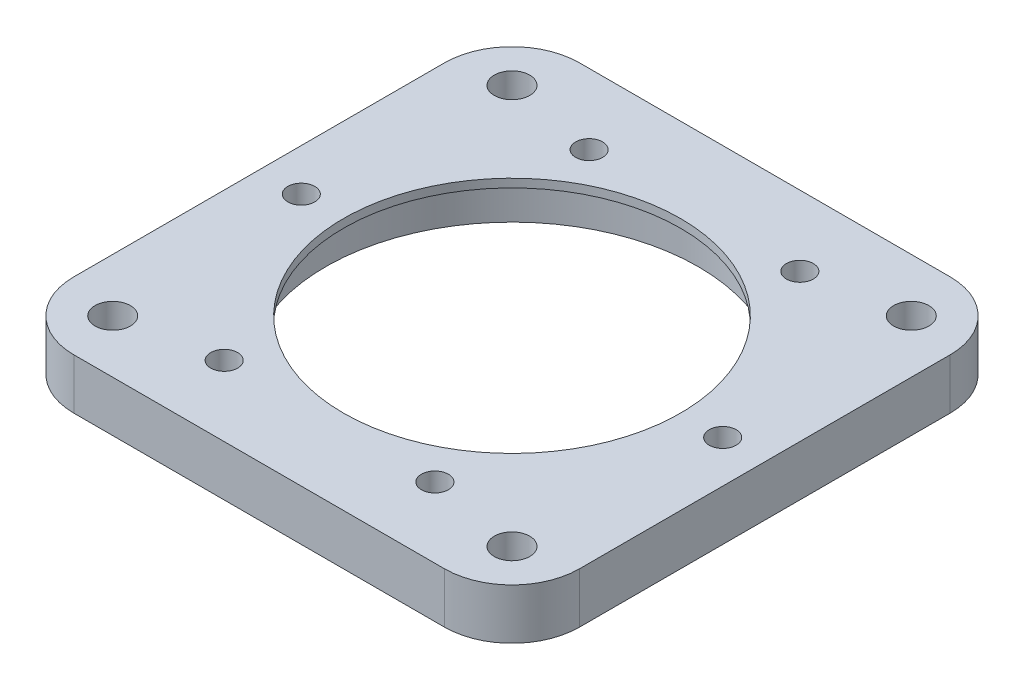
ISO-10303-21;
HEADER;
FILE_DESCRIPTION(('STEP AP214'),'2;1');
FILE_NAME('part.step','',(''),(''),'','','');
FILE_SCHEMA(('AUTOMOTIVE_DESIGN { 1 0 10303 214 1 1 1 1 }'));
ENDSEC;
DATA;
#1=APPLICATION_CONTEXT('core data for automotive mechanical design processes');
#2=APPLICATION_PROTOCOL_DEFINITION('international standard','automotive_design',2000,#1);
#3=PRODUCT_CONTEXT('',#1,'mechanical');
#4=PRODUCT('Part','Part','',(#3));
#5=PRODUCT_RELATED_PRODUCT_CATEGORY('part','',(#4));
#6=PRODUCT_DEFINITION_FORMATION('','',#4);
#7=PRODUCT_DEFINITION_CONTEXT('part definition',#1,'design');
#8=PRODUCT_DEFINITION('design','',#6,#7);
#9=PRODUCT_DEFINITION_SHAPE('','',#8);
#10=(LENGTH_UNIT() NAMED_UNIT(*) SI_UNIT(.MILLI.,.METRE.));
#11=(NAMED_UNIT(*) PLANE_ANGLE_UNIT() SI_UNIT($,.RADIAN.));
#12=(NAMED_UNIT(*) SI_UNIT($,.STERADIAN.) SOLID_ANGLE_UNIT());
#13=UNCERTAINTY_MEASURE_WITH_UNIT(LENGTH_MEASURE(1.E-05),#10,'distance_accuracy_value','');
#14=(GEOMETRIC_REPRESENTATION_CONTEXT(3) GLOBAL_UNCERTAINTY_ASSIGNED_CONTEXT((#13)) GLOBAL_UNIT_ASSIGNED_CONTEXT((#10,
#11,#12)) REPRESENTATION_CONTEXT('',''));
#15=CARTESIAN_POINT('',(0.,0.,0.));
#16=DIRECTION('',(0.,0.,1.));
#17=DIRECTION('',(1.,0.,0.));
#18=AXIS2_PLACEMENT_3D('',#15,#16,#17);
#19=CARTESIAN_POINT('',(0.,6.,0.));
#20=DIRECTION('',(0.,-1.,0.));
#21=DIRECTION('',(0.,0.,-1.));
#22=AXIS2_PLACEMENT_3D('',#19,#20,#21);
#23=CYLINDRICAL_SURFACE('',#22,20.);
#24=CARTESIAN_POINT('',(0.,6.,0.));
#25=DIRECTION('',(0.,1.,0.));
#26=DIRECTION('',(0.,0.,1.));
#27=AXIS2_PLACEMENT_3D('',#24,#25,#26);
#28=CIRCLE('',#27,20.);
#29=CARTESIAN_POINT('',(0.,6.,20.));
#30=VERTEX_POINT('',#29);
#31=EDGE_CURVE('E144',#30,#30,#28,.T.);
#32=ORIENTED_EDGE('',*,*,#31,.T.);
#33=EDGE_LOOP('',(#32));
#34=FACE_BOUND('',#33,.T.);
#35=CARTESIAN_POINT('',(0.,5.,0.));
#36=DIRECTION('',(0.,-1.,0.));
#37=DIRECTION('',(0.,0.,-1.));
#38=AXIS2_PLACEMENT_3D('',#35,#36,#37);
#39=CIRCLE('',#38,20.);
#40=CARTESIAN_POINT('',(0.,5.,-20.));
#41=VERTEX_POINT('',#40);
#42=EDGE_CURVE('E141',#41,#41,#39,.T.);
#43=ORIENTED_EDGE('',*,*,#42,.T.);
#44=EDGE_LOOP('',(#43));
#45=FACE_BOUND('',#44,.T.);
#46=ADVANCED_FACE('F41',(#34,#45),#23,.F.);
#47=CARTESIAN_POINT('',(0.,6.,0.));
#48=DIRECTION('',(0.,-1.,0.));
#49=DIRECTION('',(0.,0.,-1.));
#50=AXIS2_PLACEMENT_3D('',#47,#48,#49);
#51=PLANE('',#50);
#52=CARTESIAN_POINT('',(-23.6880771697493,6.,23.6880771697493));
#53=DIRECTION('',(0.,1.,0.));
#54=DIRECTION('',(0.,0.,1.));
#55=AXIS2_PLACEMENT_3D('',#52,#53,#54);
#56=CIRCLE('',#55,2.1);
#57=CARTESIAN_POINT('',(-23.6880771697493,6.,25.7880771697493));
#58=VERTEX_POINT('',#57);
#59=EDGE_CURVE('E220',#58,#58,#56,.T.);
#60=ORIENTED_EDGE('',*,*,#59,.F.);
#61=EDGE_LOOP('',(#60));
#62=FACE_BOUND('',#61,.T.);
#63=CARTESIAN_POINT('',(23.6880771697493,6.,23.6880771697493));
#64=DIRECTION('',(0.,1.,0.));
#65=DIRECTION('',(0.,0.,1.));
#66=AXIS2_PLACEMENT_3D('',#63,#64,#65);
#67=CIRCLE('',#66,2.1);
#68=CARTESIAN_POINT('',(23.6880771697493,6.,25.7880771697493));
#69=VERTEX_POINT('',#68);
#70=EDGE_CURVE('E227',#69,#69,#67,.T.);
#71=ORIENTED_EDGE('',*,*,#70,.F.);
#72=EDGE_LOOP('',(#71));
#73=FACE_BOUND('',#72,.T.);
#74=CARTESIAN_POINT('',(23.6880771697493,6.,-23.6880771697493));
#75=DIRECTION('',(0.,1.,0.));
#76=DIRECTION('',(0.,0.,1.));
#77=AXIS2_PLACEMENT_3D('',#74,#75,#76);
#78=CIRCLE('',#77,2.1);
#79=CARTESIAN_POINT('',(23.6880771697493,6.,-21.5880771697493));
#80=VERTEX_POINT('',#79);
#81=EDGE_CURVE('E233',#80,#80,#78,.T.);
#82=ORIENTED_EDGE('',*,*,#81,.F.);
#83=EDGE_LOOP('',(#82));
#84=FACE_BOUND('',#83,.T.);
#85=CARTESIAN_POINT('',(12.5000000000003,6.,-21.6506350946108));
#86=DIRECTION('',(0.,1.,0.));
#87=DIRECTION('',(0.,0.,1.));
#88=AXIS2_PLACEMENT_3D('',#85,#86,#87);
#89=CIRCLE('',#88,1.6);
#90=CARTESIAN_POINT('',(12.5000000000003,6.,-20.0506350946108));
#91=VERTEX_POINT('',#90);
#92=EDGE_CURVE('E197',#91,#91,#89,.T.);
#93=ORIENTED_EDGE('',*,*,#92,.F.);
#94=EDGE_LOOP('',(#93));
#95=FACE_BOUND('',#94,.T.);
#96=CARTESIAN_POINT('',(-12.4999999999998,6.,-21.6506350946111));
#97=DIRECTION('',(0.,1.,0.));
#98=DIRECTION('',(0.,0.,1.));
#99=AXIS2_PLACEMENT_3D('',#96,#97,#98);
#100=CIRCLE('',#99,1.6);
#101=CARTESIAN_POINT('',(-12.4999999999998,6.,-20.0506350946111));
#102=VERTEX_POINT('',#101);
#103=EDGE_CURVE('E196',#102,#102,#100,.T.);
#104=ORIENTED_EDGE('',*,*,#103,.F.);
#105=EDGE_LOOP('',(#104));
#106=FACE_BOUND('',#105,.T.);
#107=CARTESIAN_POINT('',(-25.,6.,-1.74574066942157E-13));
#108=DIRECTION('',(0.,1.,0.));
#109=DIRECTION('',(0.,0.,1.));
#110=AXIS2_PLACEMENT_3D('',#107,#108,#109);
#111=CIRCLE('',#110,1.6);
#112=CARTESIAN_POINT('',(-25.,6.,1.59999999999983));
#113=VERTEX_POINT('',#112);
#114=EDGE_CURVE('E203',#113,#113,#111,.T.);
#115=ORIENTED_EDGE('',*,*,#114,.F.);
#116=EDGE_LOOP('',(#115));
#117=FACE_BOUND('',#116,.T.);
#118=CARTESIAN_POINT('',(-12.5000000000001,6.,21.6506350946109));
#119=DIRECTION('',(0.,1.,0.));
#120=DIRECTION('',(0.,0.,1.));
#121=AXIS2_PLACEMENT_3D('',#118,#119,#120);
#122=CIRCLE('',#121,1.6);
#123=CARTESIAN_POINT('',(-12.5000000000001,6.,23.2506350946109));
#124=VERTEX_POINT('',#123);
#125=EDGE_CURVE('E209',#124,#124,#122,.T.);
#126=ORIENTED_EDGE('',*,*,#125,.F.);
#127=EDGE_LOOP('',(#126));
#128=FACE_BOUND('',#127,.T.);
#129=CARTESIAN_POINT('',(12.5,6.,21.650635094611));
#130=DIRECTION('',(0.,1.,0.));
#131=DIRECTION('',(0.,0.,1.));
#132=AXIS2_PLACEMENT_3D('',#129,#130,#131);
#133=CIRCLE('',#132,1.6);
#134=CARTESIAN_POINT('',(12.5,6.,23.250635094611));
#135=VERTEX_POINT('',#134);
#136=EDGE_CURVE('E190',#135,#135,#133,.T.);
#137=ORIENTED_EDGE('',*,*,#136,.F.);
#138=EDGE_LOOP('',(#137));
#139=FACE_BOUND('',#138,.T.);
#140=CARTESIAN_POINT('',(-23.6880771697493,6.,-23.6880771697493));
#141=DIRECTION('',(0.,1.,0.));
#142=DIRECTION('',(0.,0.,1.));
#143=AXIS2_PLACEMENT_3D('',#140,#141,#142);
#144=CIRCLE('',#143,2.1);
#145=CARTESIAN_POINT('',(-23.6880771697493,6.,-21.5880771697493));
#146=VERTEX_POINT('',#145);
#147=EDGE_CURVE('E221',#146,#146,#144,.T.);
#148=ORIENTED_EDGE('',*,*,#147,.F.);
#149=EDGE_LOOP('',(#148));
#150=FACE_BOUND('',#149,.T.);
#151=CARTESIAN_POINT('',(25.,6.,0.));
#152=DIRECTION('',(0.,1.,0.));
#153=DIRECTION('',(0.,0.,1.));
#154=AXIS2_PLACEMENT_3D('',#151,#152,#153);
#155=CIRCLE('',#154,1.6);
#156=CARTESIAN_POINT('',(25.,6.,1.6));
#157=VERTEX_POINT('',#156);
#158=EDGE_CURVE('E187',#157,#157,#155,.T.);
#159=ORIENTED_EDGE('',*,*,#158,.F.);
#160=EDGE_LOOP('',(#159));
#161=FACE_BOUND('',#160,.T.);
#162=DIRECTION('',(0.,0.,1.));
#163=VECTOR('',#162,1.);
#164=CARTESIAN_POINT('',(-30.,6.,30.));
#165=LINE('',#164,#163);
#166=CARTESIAN_POINT('',(-30.,6.,-22.));
#167=VERTEX_POINT('',#166);
#168=CARTESIAN_POINT('',(-30.,6.,22.));
#169=VERTEX_POINT('',#168);
#170=EDGE_CURVE('E175',#167,#169,#165,.T.);
#171=ORIENTED_EDGE('',*,*,#170,.T.);
#172=CARTESIAN_POINT('',(-22.,6.,22.));
#173=DIRECTION('',(0.,-1.,0.));
#174=DIRECTION('',(0.,0.,-1.));
#175=AXIS2_PLACEMENT_3D('',#172,#173,#174);
#176=CIRCLE('',#175,8.);
#177=CARTESIAN_POINT('',(-22.,6.,30.));
#178=VERTEX_POINT('',#177);
#179=EDGE_CURVE('E159',#169,#178,#176,.F.);
#180=ORIENTED_EDGE('',*,*,#179,.T.);
#181=DIRECTION('',(1.,0.,0.));
#182=VECTOR('',#181,1.);
#183=CARTESIAN_POINT('',(-30.,6.,30.));
#184=LINE('',#183,#182);
#185=CARTESIAN_POINT('',(22.,6.,30.));
#186=VERTEX_POINT('',#185);
#187=EDGE_CURVE('E126',#178,#186,#184,.T.);
#188=ORIENTED_EDGE('',*,*,#187,.T.);
#189=CARTESIAN_POINT('',(22.,6.,22.));
#190=DIRECTION('',(0.,-1.,0.));
#191=DIRECTION('',(0.,0.,-1.));
#192=AXIS2_PLACEMENT_3D('',#189,#190,#191);
#193=CIRCLE('',#192,8.);
#194=CARTESIAN_POINT('',(30.,6.,22.));
#195=VERTEX_POINT('',#194);
#196=EDGE_CURVE('E157',#186,#195,#193,.F.);
#197=ORIENTED_EDGE('',*,*,#196,.T.);
#198=DIRECTION('',(0.,0.,-1.));
#199=VECTOR('',#198,1.);
#200=CARTESIAN_POINT('',(30.,6.,30.));
#201=LINE('',#200,#199);
#202=CARTESIAN_POINT('',(30.,6.,-22.));
#203=VERTEX_POINT('',#202);
#204=EDGE_CURVE('E132',#195,#203,#201,.T.);
#205=ORIENTED_EDGE('',*,*,#204,.T.);
#206=CARTESIAN_POINT('',(22.,6.,-22.));
#207=DIRECTION('',(0.,-1.,0.));
#208=DIRECTION('',(0.,0.,-1.));
#209=AXIS2_PLACEMENT_3D('',#206,#207,#208);
#210=CIRCLE('',#209,8.);
#211=CARTESIAN_POINT('',(22.,6.,-30.));
#212=VERTEX_POINT('',#211);
#213=EDGE_CURVE('E61',#203,#212,#210,.F.);
#214=ORIENTED_EDGE('',*,*,#213,.T.);
#215=DIRECTION('',(-1.,0.,0.));
#216=VECTOR('',#215,1.);
#217=CARTESIAN_POINT('',(-30.,6.,-30.));
#218=LINE('',#217,#216);
#219=CARTESIAN_POINT('',(-22.,6.,-30.));
#220=VERTEX_POINT('',#219);
#221=EDGE_CURVE('E135',#212,#220,#218,.T.);
#222=ORIENTED_EDGE('',*,*,#221,.T.);
#223=CARTESIAN_POINT('',(-22.,6.,-22.));
#224=DIRECTION('',(0.,-1.,0.));
#225=DIRECTION('',(0.,0.,-1.));
#226=AXIS2_PLACEMENT_3D('',#223,#224,#225);
#227=CIRCLE('',#226,8.);
#228=EDGE_CURVE('E155',#220,#167,#227,.F.);
#229=ORIENTED_EDGE('',*,*,#228,.T.);
#230=EDGE_LOOP('',(#171,#180,#188,#197,#205,#214,#222,#229));
#231=FACE_BOUND('',#230,.T.);
#232=ORIENTED_EDGE('',*,*,#31,.F.);
#233=EDGE_LOOP('',(#232));
#234=FACE_BOUND('',#233,.T.);
#235=ADVANCED_FACE('F249',(#62,#73,#84,#95,#106,#117,#128,#139,#150,#161,#231,#234),#51,.F.);
#236=CARTESIAN_POINT('',(0.,0.,0.));
#237=DIRECTION('',(0.,-1.,0.));
#238=DIRECTION('',(0.,0.,-1.));
#239=AXIS2_PLACEMENT_3D('',#236,#237,#238);
#240=PLANE('',#239);
#241=CARTESIAN_POINT('',(-23.6880771697493,0.,23.6880771697493));
#242=DIRECTION('',(0.,1.,0.));
#243=DIRECTION('',(0.,0.,1.));
#244=AXIS2_PLACEMENT_3D('',#241,#242,#243);
#245=CIRCLE('',#244,2.1);
#246=CARTESIAN_POINT('',(-23.6880771697493,0.,25.7880771697493));
#247=VERTEX_POINT('',#246);
#248=EDGE_CURVE('E217',#247,#247,#245,.T.);
#249=ORIENTED_EDGE('',*,*,#248,.T.);
#250=EDGE_LOOP('',(#249));
#251=FACE_BOUND('',#250,.T.);
#252=CARTESIAN_POINT('',(23.6880771697493,0.,23.6880771697493));
#253=DIRECTION('',(0.,1.,0.));
#254=DIRECTION('',(0.,0.,1.));
#255=AXIS2_PLACEMENT_3D('',#252,#253,#254);
#256=CIRCLE('',#255,2.1);
#257=CARTESIAN_POINT('',(23.6880771697493,0.,25.7880771697493));
#258=VERTEX_POINT('',#257);
#259=EDGE_CURVE('E224',#258,#258,#256,.T.);
#260=ORIENTED_EDGE('',*,*,#259,.T.);
#261=EDGE_LOOP('',(#260));
#262=FACE_BOUND('',#261,.T.);
#263=CARTESIAN_POINT('',(23.6880771697493,0.,-23.6880771697493));
#264=DIRECTION('',(0.,1.,0.));
#265=DIRECTION('',(0.,0.,1.));
#266=AXIS2_PLACEMENT_3D('',#263,#264,#265);
#267=CIRCLE('',#266,2.1);
#268=CARTESIAN_POINT('',(23.6880771697493,0.,-21.5880771697493));
#269=VERTEX_POINT('',#268);
#270=EDGE_CURVE('E230',#269,#269,#267,.T.);
#271=ORIENTED_EDGE('',*,*,#270,.T.);
#272=EDGE_LOOP('',(#271));
#273=FACE_BOUND('',#272,.T.);
#274=CARTESIAN_POINT('',(12.5000000000003,0.,-21.6506350946108));
#275=DIRECTION('',(0.,1.,0.));
#276=DIRECTION('',(0.,0.,1.));
#277=AXIS2_PLACEMENT_3D('',#274,#275,#276);
#278=CIRCLE('',#277,1.6);
#279=CARTESIAN_POINT('',(12.5000000000003,0.,-20.0506350946108));
#280=VERTEX_POINT('',#279);
#281=EDGE_CURVE('E236',#280,#280,#278,.T.);
#282=ORIENTED_EDGE('',*,*,#281,.T.);
#283=EDGE_LOOP('',(#282));
#284=FACE_BOUND('',#283,.T.);
#285=CARTESIAN_POINT('',(-12.4999999999998,0.,-21.6506350946111));
#286=DIRECTION('',(0.,1.,0.));
#287=DIRECTION('',(0.,0.,1.));
#288=AXIS2_PLACEMENT_3D('',#285,#286,#287);
#289=CIRCLE('',#288,1.6);
#290=CARTESIAN_POINT('',(-12.4999999999998,0.,-20.0506350946111));
#291=VERTEX_POINT('',#290);
#292=EDGE_CURVE('E193',#291,#291,#289,.T.);
#293=ORIENTED_EDGE('',*,*,#292,.T.);
#294=EDGE_LOOP('',(#293));
#295=FACE_BOUND('',#294,.T.);
#296=CARTESIAN_POINT('',(-25.,0.,-1.74574066942157E-13));
#297=DIRECTION('',(0.,1.,0.));
#298=DIRECTION('',(0.,0.,1.));
#299=AXIS2_PLACEMENT_3D('',#296,#297,#298);
#300=CIRCLE('',#299,1.6);
#301=CARTESIAN_POINT('',(-25.,0.,1.59999999999983));
#302=VERTEX_POINT('',#301);
#303=EDGE_CURVE('E200',#302,#302,#300,.T.);
#304=ORIENTED_EDGE('',*,*,#303,.T.);
#305=EDGE_LOOP('',(#304));
#306=FACE_BOUND('',#305,.T.);
#307=CARTESIAN_POINT('',(-12.5000000000001,0.,21.6506350946109));
#308=DIRECTION('',(0.,1.,0.));
#309=DIRECTION('',(0.,0.,1.));
#310=AXIS2_PLACEMENT_3D('',#307,#308,#309);
#311=CIRCLE('',#310,1.6);
#312=CARTESIAN_POINT('',(-12.5000000000001,0.,23.2506350946109));
#313=VERTEX_POINT('',#312);
#314=EDGE_CURVE('E206',#313,#313,#311,.T.);
#315=ORIENTED_EDGE('',*,*,#314,.T.);
#316=EDGE_LOOP('',(#315));
#317=FACE_BOUND('',#316,.T.);
#318=CARTESIAN_POINT('',(12.5,0.,21.650635094611));
#319=DIRECTION('',(0.,1.,0.));
#320=DIRECTION('',(0.,0.,1.));
#321=AXIS2_PLACEMENT_3D('',#318,#319,#320);
#322=CIRCLE('',#321,1.6);
#323=CARTESIAN_POINT('',(12.5,0.,23.250635094611));
#324=VERTEX_POINT('',#323);
#325=EDGE_CURVE('E212',#324,#324,#322,.T.);
#326=ORIENTED_EDGE('',*,*,#325,.T.);
#327=EDGE_LOOP('',(#326));
#328=FACE_BOUND('',#327,.T.);
#329=CARTESIAN_POINT('',(-23.6880771697493,0.,-23.6880771697493));
#330=DIRECTION('',(0.,1.,0.));
#331=DIRECTION('',(0.,0.,1.));
#332=AXIS2_PLACEMENT_3D('',#329,#330,#331);
#333=CIRCLE('',#332,2.1);
#334=CARTESIAN_POINT('',(-23.6880771697493,0.,-21.5880771697493));
#335=VERTEX_POINT('',#334);
#336=EDGE_CURVE('E241',#335,#335,#333,.T.);
#337=ORIENTED_EDGE('',*,*,#336,.T.);
#338=EDGE_LOOP('',(#337));
#339=FACE_BOUND('',#338,.T.);
#340=CARTESIAN_POINT('',(25.,0.,0.));
#341=DIRECTION('',(0.,1.,0.));
#342=DIRECTION('',(0.,0.,1.));
#343=AXIS2_PLACEMENT_3D('',#340,#341,#342);
#344=CIRCLE('',#343,1.6);
#345=CARTESIAN_POINT('',(25.,0.,1.6));
#346=VERTEX_POINT('',#345);
#347=EDGE_CURVE('E184',#346,#346,#344,.T.);
#348=ORIENTED_EDGE('',*,*,#347,.T.);
#349=EDGE_LOOP('',(#348));
#350=FACE_BOUND('',#349,.T.);
#351=CARTESIAN_POINT('',(0.,0.,0.));
#352=DIRECTION('',(0.,-1.,0.));
#353=DIRECTION('',(0.,0.,-1.));
#354=AXIS2_PLACEMENT_3D('',#351,#352,#353);
#355=CIRCLE('',#354,22.1);
#356=CARTESIAN_POINT('',(0.,0.,-22.1));
#357=VERTEX_POINT('',#356);
#358=EDGE_CURVE('E181',#357,#357,#355,.T.);
#359=ORIENTED_EDGE('',*,*,#358,.F.);
#360=EDGE_LOOP('',(#359));
#361=FACE_BOUND('',#360,.T.);
#362=DIRECTION('',(1.,0.,0.));
#363=VECTOR('',#362,1.);
#364=CARTESIAN_POINT('',(-30.,0.,30.));
#365=LINE('',#364,#363);
#366=CARTESIAN_POINT('',(-22.,0.,30.));
#367=VERTEX_POINT('',#366);
#368=CARTESIAN_POINT('',(22.,0.,30.));
#369=VERTEX_POINT('',#368);
#370=EDGE_CURVE('E123',#367,#369,#365,.T.);
#371=ORIENTED_EDGE('',*,*,#370,.F.);
#372=CARTESIAN_POINT('',(-22.,0.,22.));
#373=DIRECTION('',(0.,-1.,0.));
#374=DIRECTION('',(0.,0.,-1.));
#375=AXIS2_PLACEMENT_3D('',#372,#373,#374);
#376=CIRCLE('',#375,8.);
#377=CARTESIAN_POINT('',(-30.,0.,22.));
#378=VERTEX_POINT('',#377);
#379=EDGE_CURVE('E106',#367,#378,#376,.T.);
#380=ORIENTED_EDGE('',*,*,#379,.T.);
#381=DIRECTION('',(0.,0.,1.));
#382=VECTOR('',#381,1.);
#383=CARTESIAN_POINT('',(-30.,0.,30.));
#384=LINE('',#383,#382);
#385=CARTESIAN_POINT('',(-30.,0.,-22.));
#386=VERTEX_POINT('',#385);
#387=EDGE_CURVE('E133',#386,#378,#384,.T.);
#388=ORIENTED_EDGE('',*,*,#387,.F.);
#389=CARTESIAN_POINT('',(-22.,0.,-22.));
#390=DIRECTION('',(0.,-1.,0.));
#391=DIRECTION('',(0.,0.,-1.));
#392=AXIS2_PLACEMENT_3D('',#389,#390,#391);
#393=CIRCLE('',#392,8.);
#394=CARTESIAN_POINT('',(-22.,0.,-30.));
#395=VERTEX_POINT('',#394);
#396=EDGE_CURVE('E148',#386,#395,#393,.T.);
#397=ORIENTED_EDGE('',*,*,#396,.T.);
#398=DIRECTION('',(-1.,0.,0.));
#399=VECTOR('',#398,1.);
#400=CARTESIAN_POINT('',(-30.,0.,-30.));
#401=LINE('',#400,#399);
#402=CARTESIAN_POINT('',(22.,0.,-30.));
#403=VERTEX_POINT('',#402);
#404=EDGE_CURVE('E137',#403,#395,#401,.T.);
#405=ORIENTED_EDGE('',*,*,#404,.F.);
#406=CARTESIAN_POINT('',(22.,0.,-22.));
#407=DIRECTION('',(0.,-1.,0.));
#408=DIRECTION('',(0.,0.,-1.));
#409=AXIS2_PLACEMENT_3D('',#406,#407,#408);
#410=CIRCLE('',#409,8.);
#411=CARTESIAN_POINT('',(30.,0.,-22.));
#412=VERTEX_POINT('',#411);
#413=EDGE_CURVE('E127',#403,#412,#410,.T.);
#414=ORIENTED_EDGE('',*,*,#413,.T.);
#415=DIRECTION('',(0.,0.,-1.));
#416=VECTOR('',#415,1.);
#417=CARTESIAN_POINT('',(30.,0.,30.));
#418=LINE('',#417,#416);
#419=CARTESIAN_POINT('',(30.,0.,22.));
#420=VERTEX_POINT('',#419);
#421=EDGE_CURVE('E171',#420,#412,#418,.T.);
#422=ORIENTED_EDGE('',*,*,#421,.F.);
#423=CARTESIAN_POINT('',(22.,0.,22.));
#424=DIRECTION('',(0.,-1.,0.));
#425=DIRECTION('',(0.,0.,-1.));
#426=AXIS2_PLACEMENT_3D('',#423,#424,#425);
#427=CIRCLE('',#426,8.);
#428=EDGE_CURVE('E117',#420,#369,#427,.T.);
#429=ORIENTED_EDGE('',*,*,#428,.T.);
#430=EDGE_LOOP('',(#371,#380,#388,#397,#405,#414,#422,#429));
#431=FACE_BOUND('',#430,.T.);
#432=ADVANCED_FACE('F130',(#251,#262,#273,#284,#295,#306,#317,#328,#339,#350,#361,#431),#240,.T.);
#433=CARTESIAN_POINT('',(30.,6.,30.));
#434=DIRECTION('',(-1.,0.,0.));
#435=DIRECTION('',(0.,0.,1.));
#436=AXIS2_PLACEMENT_3D('',#433,#434,#435);
#437=PLANE('',#436);
#438=ORIENTED_EDGE('',*,*,#204,.F.);
#439=DIRECTION('',(0.,-1.,0.));
#440=VECTOR('',#439,1.);
#441=CARTESIAN_POINT('',(30.,6.,22.));
#442=LINE('',#441,#440);
#443=EDGE_CURVE('E163',#195,#420,#442,.T.);
#444=ORIENTED_EDGE('',*,*,#443,.T.);
#445=ORIENTED_EDGE('',*,*,#421,.T.);
#446=DIRECTION('',(0.,-1.,0.));
#447=VECTOR('',#446,1.);
#448=CARTESIAN_POINT('',(30.,6.,-22.));
#449=LINE('',#448,#447);
#450=EDGE_CURVE('E161',#412,#203,#449,.F.);
#451=ORIENTED_EDGE('',*,*,#450,.T.);
#452=EDGE_LOOP('',(#438,#444,#445,#451));
#453=FACE_BOUND('',#452,.T.);
#454=ADVANCED_FACE('F278',(#453),#437,.F.);
#455=CARTESIAN_POINT('',(-30.,6.,-30.));
#456=DIRECTION('',(0.,0.,1.));
#457=DIRECTION('',(1.,0.,0.));
#458=AXIS2_PLACEMENT_3D('',#455,#456,#457);
#459=PLANE('',#458);
#460=ORIENTED_EDGE('',*,*,#404,.T.);
#461=DIRECTION('',(0.,-1.,0.));
#462=VECTOR('',#461,1.);
#463=CARTESIAN_POINT('',(-22.,6.,-30.));
#464=LINE('',#463,#462);
#465=EDGE_CURVE('E11',#395,#220,#464,.F.);
#466=ORIENTED_EDGE('',*,*,#465,.T.);
#467=ORIENTED_EDGE('',*,*,#221,.F.);
#468=DIRECTION('',(0.,-1.,0.));
#469=VECTOR('',#468,1.);
#470=CARTESIAN_POINT('',(22.,6.,-30.));
#471=LINE('',#470,#469);
#472=EDGE_CURVE('E49',#212,#403,#471,.T.);
#473=ORIENTED_EDGE('',*,*,#472,.T.);
#474=EDGE_LOOP('',(#460,#466,#467,#473));
#475=FACE_BOUND('',#474,.T.);
#476=ADVANCED_FACE('F168',(#475),#459,.F.);
#477=CARTESIAN_POINT('',(-30.,6.,30.));
#478=DIRECTION('',(1.,0.,0.));
#479=DIRECTION('',(0.,0.,-1.));
#480=AXIS2_PLACEMENT_3D('',#477,#478,#479);
#481=PLANE('',#480);
#482=ORIENTED_EDGE('',*,*,#387,.T.);
#483=DIRECTION('',(0.,-1.,0.));
#484=VECTOR('',#483,1.);
#485=CARTESIAN_POINT('',(-30.,6.,22.));
#486=LINE('',#485,#484);
#487=EDGE_CURVE('E111',#378,#169,#486,.F.);
#488=ORIENTED_EDGE('',*,*,#487,.T.);
#489=ORIENTED_EDGE('',*,*,#170,.F.);
#490=DIRECTION('',(0.,-1.,0.));
#491=VECTOR('',#490,1.);
#492=CARTESIAN_POINT('',(-30.,6.,-22.));
#493=LINE('',#492,#491);
#494=EDGE_CURVE('E116',#167,#386,#493,.T.);
#495=ORIENTED_EDGE('',*,*,#494,.T.);
#496=EDGE_LOOP('',(#482,#488,#489,#495));
#497=FACE_BOUND('',#496,.T.);
#498=ADVANCED_FACE('F290',(#497),#481,.F.);
#499=CARTESIAN_POINT('',(-30.,6.,30.));
#500=DIRECTION('',(0.,0.,-1.));
#501=DIRECTION('',(-1.,0.,0.));
#502=AXIS2_PLACEMENT_3D('',#499,#500,#501);
#503=PLANE('',#502);
#504=ORIENTED_EDGE('',*,*,#187,.F.);
#505=DIRECTION('',(0.,-1.,0.));
#506=VECTOR('',#505,1.);
#507=CARTESIAN_POINT('',(-22.,6.,30.));
#508=LINE('',#507,#506);
#509=EDGE_CURVE('E110',#178,#367,#508,.T.);
#510=ORIENTED_EDGE('',*,*,#509,.T.);
#511=ORIENTED_EDGE('',*,*,#370,.T.);
#512=DIRECTION('',(0.,-1.,0.));
#513=VECTOR('',#512,1.);
#514=CARTESIAN_POINT('',(22.,6.,30.));
#515=LINE('',#514,#513);
#516=EDGE_CURVE('E128',#369,#186,#515,.F.);
#517=ORIENTED_EDGE('',*,*,#516,.T.);
#518=EDGE_LOOP('',(#504,#510,#511,#517));
#519=FACE_BOUND('',#518,.T.);
#520=ADVANCED_FACE('F122',(#519),#503,.F.);
#521=CARTESIAN_POINT('',(0.,5.,0.));
#522=DIRECTION('',(0.,-1.,0.));
#523=DIRECTION('',(0.,0.,-1.));
#524=AXIS2_PLACEMENT_3D('',#521,#522,#523);
#525=CYLINDRICAL_SURFACE('',#524,22.1);
#526=CARTESIAN_POINT('',(0.,5.,0.));
#527=DIRECTION('',(0.,-1.,0.));
#528=DIRECTION('',(0.,0.,-1.));
#529=AXIS2_PLACEMENT_3D('',#526,#527,#528);
#530=CIRCLE('',#529,22.1);
#531=CARTESIAN_POINT('',(0.,5.,-22.1));
#532=VERTEX_POINT('',#531);
#533=EDGE_CURVE('E145',#532,#532,#530,.T.);
#534=ORIENTED_EDGE('',*,*,#533,.F.);
#535=EDGE_LOOP('',(#534));
#536=FACE_BOUND('',#535,.T.);
#537=ORIENTED_EDGE('',*,*,#358,.T.);
#538=EDGE_LOOP('',(#537));
#539=FACE_BOUND('',#538,.T.);
#540=ADVANCED_FACE('F268',(#536,#539),#525,.F.);
#541=CARTESIAN_POINT('',(0.,5.,0.));
#542=DIRECTION('',(0.,-1.,0.));
#543=DIRECTION('',(0.,0.,-1.));
#544=AXIS2_PLACEMENT_3D('',#541,#542,#543);
#545=PLANE('',#544);
#546=ORIENTED_EDGE('',*,*,#42,.F.);
#547=EDGE_LOOP('',(#546));
#548=FACE_BOUND('',#547,.T.);
#549=ORIENTED_EDGE('',*,*,#533,.T.);
#550=EDGE_LOOP('',(#549));
#551=FACE_BOUND('',#550,.T.);
#552=ADVANCED_FACE('F264',(#548,#551),#545,.T.);
#553=CARTESIAN_POINT('',(25.,0.,0.));
#554=DIRECTION('',(0.,1.,0.));
#555=DIRECTION('',(0.,0.,1.));
#556=AXIS2_PLACEMENT_3D('',#553,#554,#555);
#557=CYLINDRICAL_SURFACE('',#556,1.6);
#558=ORIENTED_EDGE('',*,*,#347,.F.);
#559=EDGE_LOOP('',(#558));
#560=FACE_BOUND('',#559,.T.);
#561=ORIENTED_EDGE('',*,*,#158,.T.);
#562=EDGE_LOOP('',(#561));
#563=FACE_BOUND('',#562,.T.);
#564=ADVANCED_FACE('F267',(#560,#563),#557,.F.);
#565=CARTESIAN_POINT('',(-23.6880771697493,0.,-23.6880771697493));
#566=DIRECTION('',(0.,1.,0.));
#567=DIRECTION('',(0.,0.,1.));
#568=AXIS2_PLACEMENT_3D('',#565,#566,#567);
#569=CYLINDRICAL_SURFACE('',#568,2.1);
#570=ORIENTED_EDGE('',*,*,#336,.F.);
#571=EDGE_LOOP('',(#570));
#572=FACE_BOUND('',#571,.T.);
#573=ORIENTED_EDGE('',*,*,#147,.T.);
#574=EDGE_LOOP('',(#573));
#575=FACE_BOUND('',#574,.T.);
#576=ADVANCED_FACE('F247',(#572,#575),#569,.F.);
#577=CARTESIAN_POINT('',(12.5,0.,21.650635094611));
#578=DIRECTION('',(0.,1.,0.));
#579=DIRECTION('',(0.,0.,1.));
#580=AXIS2_PLACEMENT_3D('',#577,#578,#579);
#581=CYLINDRICAL_SURFACE('',#580,1.6);
#582=ORIENTED_EDGE('',*,*,#325,.F.);
#583=EDGE_LOOP('',(#582));
#584=FACE_BOUND('',#583,.T.);
#585=ORIENTED_EDGE('',*,*,#136,.T.);
#586=EDGE_LOOP('',(#585));
#587=FACE_BOUND('',#586,.T.);
#588=ADVANCED_FACE('F402',(#584,#587),#581,.F.);
#589=CARTESIAN_POINT('',(-12.5000000000001,0.,21.6506350946109));
#590=DIRECTION('',(0.,1.,0.));
#591=DIRECTION('',(0.,0.,1.));
#592=AXIS2_PLACEMENT_3D('',#589,#590,#591);
#593=CYLINDRICAL_SURFACE('',#592,1.6);
#594=ORIENTED_EDGE('',*,*,#314,.F.);
#595=EDGE_LOOP('',(#594));
#596=FACE_BOUND('',#595,.T.);
#597=ORIENTED_EDGE('',*,*,#125,.T.);
#598=EDGE_LOOP('',(#597));
#599=FACE_BOUND('',#598,.T.);
#600=ADVANCED_FACE('F392',(#596,#599),#593,.F.);
#601=CARTESIAN_POINT('',(-25.,0.,-1.74574066942157E-13));
#602=DIRECTION('',(0.,1.,0.));
#603=DIRECTION('',(0.,0.,1.));
#604=AXIS2_PLACEMENT_3D('',#601,#602,#603);
#605=CYLINDRICAL_SURFACE('',#604,1.6);
#606=ORIENTED_EDGE('',*,*,#303,.F.);
#607=EDGE_LOOP('',(#606));
#608=FACE_BOUND('',#607,.T.);
#609=ORIENTED_EDGE('',*,*,#114,.T.);
#610=EDGE_LOOP('',(#609));
#611=FACE_BOUND('',#610,.T.);
#612=ADVANCED_FACE('F382',(#608,#611),#605,.F.);
#613=CARTESIAN_POINT('',(-12.4999999999998,0.,-21.6506350946111));
#614=DIRECTION('',(0.,1.,0.));
#615=DIRECTION('',(0.,0.,1.));
#616=AXIS2_PLACEMENT_3D('',#613,#614,#615);
#617=CYLINDRICAL_SURFACE('',#616,1.6);
#618=ORIENTED_EDGE('',*,*,#292,.F.);
#619=EDGE_LOOP('',(#618));
#620=FACE_BOUND('',#619,.T.);
#621=ORIENTED_EDGE('',*,*,#103,.T.);
#622=EDGE_LOOP('',(#621));
#623=FACE_BOUND('',#622,.T.);
#624=ADVANCED_FACE('F372',(#620,#623),#617,.F.);
#625=CARTESIAN_POINT('',(12.5000000000003,0.,-21.6506350946108));
#626=DIRECTION('',(0.,1.,0.));
#627=DIRECTION('',(0.,0.,1.));
#628=AXIS2_PLACEMENT_3D('',#625,#626,#627);
#629=CYLINDRICAL_SURFACE('',#628,1.6);
#630=ORIENTED_EDGE('',*,*,#281,.F.);
#631=EDGE_LOOP('',(#630));
#632=FACE_BOUND('',#631,.T.);
#633=ORIENTED_EDGE('',*,*,#92,.T.);
#634=EDGE_LOOP('',(#633));
#635=FACE_BOUND('',#634,.T.);
#636=ADVANCED_FACE('F362',(#632,#635),#629,.F.);
#637=CARTESIAN_POINT('',(23.6880771697493,0.,-23.6880771697493));
#638=DIRECTION('',(0.,1.,0.));
#639=DIRECTION('',(0.,0.,1.));
#640=AXIS2_PLACEMENT_3D('',#637,#638,#639);
#641=CYLINDRICAL_SURFACE('',#640,2.1);
#642=ORIENTED_EDGE('',*,*,#270,.F.);
#643=EDGE_LOOP('',(#642));
#644=FACE_BOUND('',#643,.T.);
#645=ORIENTED_EDGE('',*,*,#81,.T.);
#646=EDGE_LOOP('',(#645));
#647=FACE_BOUND('',#646,.T.);
#648=ADVANCED_FACE('F352',(#644,#647),#641,.F.);
#649=CARTESIAN_POINT('',(23.6880771697493,0.,23.6880771697493));
#650=DIRECTION('',(0.,1.,0.));
#651=DIRECTION('',(0.,0.,1.));
#652=AXIS2_PLACEMENT_3D('',#649,#650,#651);
#653=CYLINDRICAL_SURFACE('',#652,2.1);
#654=ORIENTED_EDGE('',*,*,#259,.F.);
#655=EDGE_LOOP('',(#654));
#656=FACE_BOUND('',#655,.T.);
#657=ORIENTED_EDGE('',*,*,#70,.T.);
#658=EDGE_LOOP('',(#657));
#659=FACE_BOUND('',#658,.T.);
#660=ADVANCED_FACE('F342',(#656,#659),#653,.F.);
#661=CARTESIAN_POINT('',(-23.6880771697493,0.,23.6880771697493));
#662=DIRECTION('',(0.,1.,0.));
#663=DIRECTION('',(0.,0.,1.));
#664=AXIS2_PLACEMENT_3D('',#661,#662,#663);
#665=CYLINDRICAL_SURFACE('',#664,2.1);
#666=ORIENTED_EDGE('',*,*,#248,.F.);
#667=EDGE_LOOP('',(#666));
#668=FACE_BOUND('',#667,.T.);
#669=ORIENTED_EDGE('',*,*,#59,.T.);
#670=EDGE_LOOP('',(#669));
#671=FACE_BOUND('',#670,.T.);
#672=ADVANCED_FACE('F299',(#668,#671),#665,.F.);
#673=CARTESIAN_POINT('',(-22.,6.,22.));
#674=DIRECTION('',(0.,-1.,0.));
#675=DIRECTION('',(0.,0.,-1.));
#676=AXIS2_PLACEMENT_3D('',#673,#674,#675);
#677=CYLINDRICAL_SURFACE('',#676,8.);
#678=ORIENTED_EDGE('',*,*,#179,.F.);
#679=ORIENTED_EDGE('',*,*,#487,.F.);
#680=ORIENTED_EDGE('',*,*,#379,.F.);
#681=ORIENTED_EDGE('',*,*,#509,.F.);
#682=EDGE_LOOP('',(#678,#679,#680,#681));
#683=FACE_BOUND('',#682,.T.);
#684=ADVANCED_FACE('F109',(#683),#677,.T.);
#685=CARTESIAN_POINT('',(22.,6.,22.));
#686=DIRECTION('',(0.,-1.,0.));
#687=DIRECTION('',(0.,0.,-1.));
#688=AXIS2_PLACEMENT_3D('',#685,#686,#687);
#689=CYLINDRICAL_SURFACE('',#688,8.);
#690=ORIENTED_EDGE('',*,*,#196,.F.);
#691=ORIENTED_EDGE('',*,*,#516,.F.);
#692=ORIENTED_EDGE('',*,*,#428,.F.);
#693=ORIENTED_EDGE('',*,*,#443,.F.);
#694=EDGE_LOOP('',(#690,#691,#692,#693));
#695=FACE_BOUND('',#694,.T.);
#696=ADVANCED_FACE('F298',(#695),#689,.T.);
#697=CARTESIAN_POINT('',(-22.,6.,-22.));
#698=DIRECTION('',(0.,-1.,0.));
#699=DIRECTION('',(0.,0.,-1.));
#700=AXIS2_PLACEMENT_3D('',#697,#698,#699);
#701=CYLINDRICAL_SURFACE('',#700,8.);
#702=ORIENTED_EDGE('',*,*,#228,.F.);
#703=ORIENTED_EDGE('',*,*,#465,.F.);
#704=ORIENTED_EDGE('',*,*,#396,.F.);
#705=ORIENTED_EDGE('',*,*,#494,.F.);
#706=EDGE_LOOP('',(#702,#703,#704,#705));
#707=FACE_BOUND('',#706,.T.);
#708=ADVANCED_FACE('F301',(#707),#701,.T.);
#709=CARTESIAN_POINT('',(22.,6.,-22.));
#710=DIRECTION('',(0.,-1.,0.));
#711=DIRECTION('',(0.,0.,-1.));
#712=AXIS2_PLACEMENT_3D('',#709,#710,#711);
#713=CYLINDRICAL_SURFACE('',#712,8.);
#714=ORIENTED_EDGE('',*,*,#213,.F.);
#715=ORIENTED_EDGE('',*,*,#450,.F.);
#716=ORIENTED_EDGE('',*,*,#413,.F.);
#717=ORIENTED_EDGE('',*,*,#472,.F.);
#718=EDGE_LOOP('',(#714,#715,#716,#717));
#719=FACE_BOUND('',#718,.T.);
#720=ADVANCED_FACE('F43',(#719),#713,.T.);
#721=CLOSED_SHELL('',(#46,#235,#432,#454,#476,#498,#520,#540,#552,#564,#576,#588,#600,#612,#624,
#636,#648,#660,#672,#684,#696,#708,#720));
#722=MANIFOLD_SOLID_BREP('B2',#721);
#723=ADVANCED_BREP_SHAPE_REPRESENTATION('',(#18,#722),#14);
#724=SHAPE_DEFINITION_REPRESENTATION(#9,#723);
ENDSEC;
END-ISO-10303-21;
